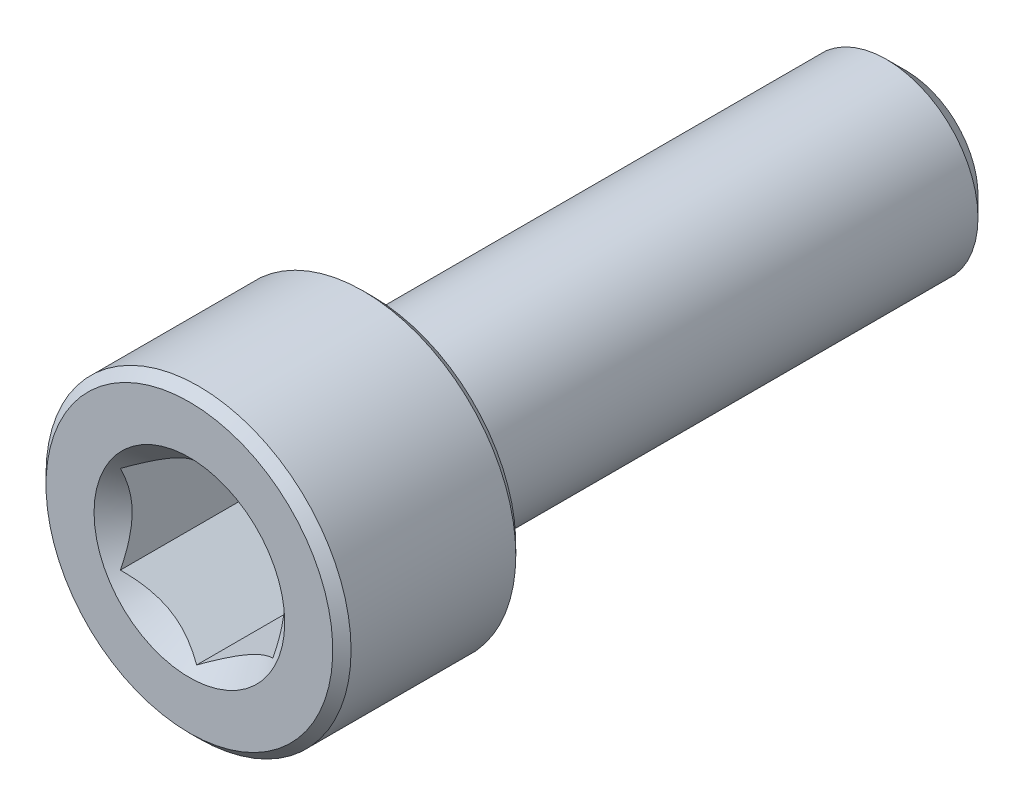
ISO-10303-21;
HEADER;
FILE_DESCRIPTION(('STEP AP214'),'2;1');
FILE_NAME('part.step','',(''),(''),'','','');
FILE_SCHEMA(('AUTOMOTIVE_DESIGN { 1 0 10303 214 1 1 1 1 }'));
ENDSEC;
DATA;
#1=APPLICATION_CONTEXT('core data for automotive mechanical design processes');
#2=APPLICATION_PROTOCOL_DEFINITION('international standard','automotive_design',2000,#1);
#3=PRODUCT_CONTEXT('',#1,'mechanical');
#4=PRODUCT('Part','Part','',(#3));
#5=PRODUCT_RELATED_PRODUCT_CATEGORY('part','',(#4));
#6=PRODUCT_DEFINITION_FORMATION('','',#4);
#7=PRODUCT_DEFINITION_CONTEXT('part definition',#1,'design');
#8=PRODUCT_DEFINITION('design','',#6,#7);
#9=PRODUCT_DEFINITION_SHAPE('','',#8);
#10=(LENGTH_UNIT() NAMED_UNIT(*) SI_UNIT(.MILLI.,.METRE.));
#11=(NAMED_UNIT(*) PLANE_ANGLE_UNIT() SI_UNIT($,.RADIAN.));
#12=(NAMED_UNIT(*) SI_UNIT($,.STERADIAN.) SOLID_ANGLE_UNIT());
#13=UNCERTAINTY_MEASURE_WITH_UNIT(LENGTH_MEASURE(1.E-05),#10,'distance_accuracy_value','');
#14=(GEOMETRIC_REPRESENTATION_CONTEXT(3) GLOBAL_UNCERTAINTY_ASSIGNED_CONTEXT((#13)) GLOBAL_UNIT_ASSIGNED_CONTEXT((#10,
#11,#12)) REPRESENTATION_CONTEXT('',''));
#15=CARTESIAN_POINT('',(0.,0.,0.));
#16=DIRECTION('',(0.,0.,1.));
#17=DIRECTION('',(1.,0.,0.));
#18=AXIS2_PLACEMENT_3D('',#15,#16,#17);
#19=CARTESIAN_POINT('',(0.,0.,-10.5));
#20=DIRECTION('',(0.,0.,-1.));
#21=DIRECTION('',(0.,1.,0.));
#22=AXIS2_PLACEMENT_3D('',#19,#20,#21);
#23=CYLINDRICAL_SURFACE('',#22,3.);
#24=CARTESIAN_POINT('',(0.,0.,4.2));
#25=DIRECTION('',(0.,0.,-1.));
#26=DIRECTION('',(0.,1.,0.));
#27=AXIS2_PLACEMENT_3D('',#24,#25,#26);
#28=CIRCLE('',#27,3.);
#29=CARTESIAN_POINT('',(0.,3.,4.2));
#30=VERTEX_POINT('',#29);
#31=EDGE_CURVE('E56',#30,#30,#28,.T.);
#32=ORIENTED_EDGE('',*,*,#31,.T.);
#33=EDGE_LOOP('',(#32));
#34=FACE_BOUND('',#33,.T.);
#35=CARTESIAN_POINT('',(0.,0.,-12.3504809471617));
#36=DIRECTION('',(0.,0.,-1.));
#37=DIRECTION('',(0.,1.,0.));
#38=AXIS2_PLACEMENT_3D('',#35,#36,#37);
#39=CIRCLE('',#38,3.);
#40=CARTESIAN_POINT('',(0.,3.,-12.3504809471617));
#41=VERTEX_POINT('',#40);
#42=EDGE_CURVE('E372',#41,#41,#39,.T.);
#43=ORIENTED_EDGE('',*,*,#42,.F.);
#44=EDGE_LOOP('',(#43));
#45=FACE_BOUND('',#44,.T.);
#46=ADVANCED_FACE('F43',(#34,#45),#23,.T.);
#47=CARTESIAN_POINT('',(0.,0.,4.2));
#48=DIRECTION('',(0.,0.,-1.));
#49=DIRECTION('',(0.,1.,0.));
#50=AXIS2_PLACEMENT_3D('',#47,#48,#49);
#51=TOROIDAL_SURFACE('',#50,3.3,0.3);
#52=CARTESIAN_POINT('',(0.,0.,4.5));
#53=DIRECTION('',(0.,0.,-1.));
#54=DIRECTION('',(0.,1.,0.));
#55=AXIS2_PLACEMENT_3D('',#52,#53,#54);
#56=CIRCLE('',#55,3.3);
#57=CARTESIAN_POINT('',(0.,3.3,4.5));
#58=VERTEX_POINT('',#57);
#59=EDGE_CURVE('E153',#58,#58,#56,.T.);
#60=ORIENTED_EDGE('',*,*,#59,.T.);
#61=EDGE_LOOP('',(#60));
#62=FACE_BOUND('',#61,.T.);
#63=ORIENTED_EDGE('',*,*,#31,.F.);
#64=EDGE_LOOP('',(#63));
#65=FACE_BOUND('',#64,.T.);
#66=ADVANCED_FACE('F160',(#62,#65),#51,.F.);
#67=CARTESIAN_POINT('',(0.,4.7,4.5));
#68=DIRECTION('',(0.,0.,-1.));
#69=DIRECTION('',(0.,1.,0.));
#70=AXIS2_PLACEMENT_3D('',#67,#68,#69);
#71=PLANE('',#70);
#72=CARTESIAN_POINT('',(0.,0.,4.5));
#73=DIRECTION('',(0.,0.,-1.));
#74=DIRECTION('',(0.,1.,0.));
#75=AXIS2_PLACEMENT_3D('',#72,#73,#74);
#76=CIRCLE('',#75,4.7);
#77=CARTESIAN_POINT('',(0.,4.7,4.5));
#78=VERTEX_POINT('',#77);
#79=EDGE_CURVE('E150',#78,#78,#76,.T.);
#80=ORIENTED_EDGE('',*,*,#79,.T.);
#81=EDGE_LOOP('',(#80));
#82=FACE_BOUND('',#81,.T.);
#83=ORIENTED_EDGE('',*,*,#59,.F.);
#84=EDGE_LOOP('',(#83));
#85=FACE_BOUND('',#84,.T.);
#86=ADVANCED_FACE('F162',(#82,#85),#71,.T.);
#87=CARTESIAN_POINT('',(0.,0.,4.5));
#88=DIRECTION('',(0.,0.,1.));
#89=DIRECTION('',(0.,-1.,0.));
#90=AXIS2_PLACEMENT_3D('',#87,#88,#89);
#91=CONICAL_SURFACE('',#90,4.7,0.785398163397451);
#92=CARTESIAN_POINT('',(0.,0.,4.8));
#93=DIRECTION('',(0.,0.,-1.));
#94=DIRECTION('',(0.,1.,0.));
#95=AXIS2_PLACEMENT_3D('',#92,#93,#94);
#96=CIRCLE('',#95,5.);
#97=CARTESIAN_POINT('',(0.,5.,4.8));
#98=VERTEX_POINT('',#97);
#99=EDGE_CURVE('E147',#98,#98,#96,.T.);
#100=ORIENTED_EDGE('',*,*,#99,.T.);
#101=EDGE_LOOP('',(#100));
#102=FACE_BOUND('',#101,.T.);
#103=ORIENTED_EDGE('',*,*,#79,.F.);
#104=EDGE_LOOP('',(#103));
#105=FACE_BOUND('',#104,.T.);
#106=ADVANCED_FACE('F168',(#102,#105),#91,.T.);
#107=CARTESIAN_POINT('',(0.,0.,-10.5));
#108=DIRECTION('',(0.,0.,-1.));
#109=DIRECTION('',(0.,1.,0.));
#110=AXIS2_PLACEMENT_3D('',#107,#108,#109);
#111=CYLINDRICAL_SURFACE('',#110,5.);
#112=CARTESIAN_POINT('',(0.,0.,10.2));
#113=DIRECTION('',(0.,0.,-1.));
#114=DIRECTION('',(0.,1.,0.));
#115=AXIS2_PLACEMENT_3D('',#112,#113,#114);
#116=CIRCLE('',#115,5.);
#117=CARTESIAN_POINT('',(0.,5.,10.2));
#118=VERTEX_POINT('',#117);
#119=EDGE_CURVE('E144',#118,#118,#116,.T.);
#120=ORIENTED_EDGE('',*,*,#119,.T.);
#121=EDGE_LOOP('',(#120));
#122=FACE_BOUND('',#121,.T.);
#123=ORIENTED_EDGE('',*,*,#99,.F.);
#124=EDGE_LOOP('',(#123));
#125=FACE_BOUND('',#124,.T.);
#126=ADVANCED_FACE('F275',(#122,#125),#111,.T.);
#127=CARTESIAN_POINT('',(0.,0.,10.2));
#128=DIRECTION('',(0.,0.,-1.));
#129=DIRECTION('',(0.,1.,0.));
#130=AXIS2_PLACEMENT_3D('',#127,#128,#129);
#131=CONICAL_SURFACE('',#130,5.,0.785398163397445);
#132=CARTESIAN_POINT('',(0.,0.,10.5));
#133=DIRECTION('',(0.,0.,-1.));
#134=DIRECTION('',(0.,1.,0.));
#135=AXIS2_PLACEMENT_3D('',#132,#133,#134);
#136=CIRCLE('',#135,4.7);
#137=CARTESIAN_POINT('',(0.,4.7,10.5));
#138=VERTEX_POINT('',#137);
#139=EDGE_CURVE('E141',#138,#138,#136,.T.);
#140=ORIENTED_EDGE('',*,*,#139,.T.);
#141=EDGE_LOOP('',(#140));
#142=FACE_BOUND('',#141,.T.);
#143=ORIENTED_EDGE('',*,*,#119,.F.);
#144=EDGE_LOOP('',(#143));
#145=FACE_BOUND('',#144,.T.);
#146=ADVANCED_FACE('F267',(#142,#145),#131,.T.);
#147=CARTESIAN_POINT('',(0.,0.,10.5));
#148=DIRECTION('',(0.,0.,1.));
#149=DIRECTION('',(0.,-1.,0.));
#150=AXIS2_PLACEMENT_3D('',#147,#148,#149);
#151=PLANE('',#150);
#152=CARTESIAN_POINT('',(0.,0.,10.5));
#153=DIRECTION('',(0.,0.,1.));
#154=DIRECTION('',(1.,0.,0.));
#155=AXIS2_PLACEMENT_3D('',#152,#153,#154);
#156=CIRCLE('',#155,3.125);
#157=CARTESIAN_POINT('',(3.125,0.,10.5));
#158=VERTEX_POINT('',#157);
#159=EDGE_CURVE('E115',#158,#158,#156,.T.);
#160=ORIENTED_EDGE('',*,*,#159,.F.);
#161=EDGE_LOOP('',(#160));
#162=FACE_BOUND('',#161,.T.);
#163=ORIENTED_EDGE('',*,*,#139,.F.);
#164=EDGE_LOOP('',(#163));
#165=FACE_BOUND('',#164,.T.);
#166=ADVANCED_FACE('F210',(#162,#165),#151,.T.);
#167=CARTESIAN_POINT('',(0.,0.,10.5));
#168=DIRECTION('',(0.,0.,1.));
#169=DIRECTION('',(1.,0.,0.));
#170=AXIS2_PLACEMENT_3D('',#167,#168,#169);
#171=CONICAL_SURFACE('',#170,3.125,0.78539816339745);
#172=ORIENTED_EDGE('',*,*,#159,.T.);
#173=EDGE_LOOP('',(#172));
#174=FACE_BOUND('',#173,.T.);
#175=CARTESIAN_POINT('',(-0.000200000000000056,-2.88686681600197,10.2618668229299));
#176=CARTESIAN_POINT('',(0.0857382777877649,-2.83725032818751,10.2122920513029));
#177=CARTESIAN_POINT('',(0.173113567275753,-2.7868041812811,10.1656288273106));
#178=CARTESIAN_POINT('',(0.351281456165589,-2.6839389026696,10.0801894859864));
#179=CARTESIAN_POINT('',(0.442091000681075,-2.6315099876986,10.0414609083541));
#180=CARTESIAN_POINT('',(0.625204123126921,-2.52578957716234,9.97511804984587));
#181=CARTESIAN_POINT('',(0.71746106452934,-2.47252500720904,9.94733701447898));
#182=CARTESIAN_POINT('',(0.904006008776285,-2.3648232334321,9.9045345218588));
#183=CARTESIAN_POINT('',(0.998288312566282,-2.31038931995913,9.88948111261947));
#184=CARTESIAN_POINT('',(1.16077825829184,-2.21657570605387,9.87589906815761));
#185=CARTESIAN_POINT('',(1.22877596788015,-2.17731721011878,9.87388844518893));
#186=CARTESIAN_POINT('',(1.36466024116922,-2.0988643883567,9.87727546313562));
#187=CARTESIAN_POINT('',(1.43254675755224,-2.05967008984862,9.88267570124795));
#188=CARTESIAN_POINT('',(1.56767878823611,-1.98165157555715,9.9005771343506));
#189=CARTESIAN_POINT('',(1.63492349975356,-1.94282782326097,9.91308627299461));
#190=CARTESIAN_POINT('',(1.7682501008182,-1.86585167424616,9.94451884790384));
#191=CARTESIAN_POINT('',(1.83433207909966,-1.82769922629678,9.96344179244495));
#192=CARTESIAN_POINT('',(2.00359634669126,-1.72997445583858,10.0196187073564));
#193=CARTESIAN_POINT('',(2.10572912222289,-1.67100807039231,10.0611071775443));
#194=CARTESIAN_POINT('',(2.25590641494051,-1.58430317001562,10.1311453926712));
#195=CARTESIAN_POINT('',(2.30539653988261,-1.55573003305807,10.1557535980642));
#196=CARTESIAN_POINT('',(2.40346006383885,-1.49911303110426,10.2072132326634));
#197=CARTESIAN_POINT('',(2.45203400349693,-1.47106885396706,10.2340632847275));
#198=CARTESIAN_POINT('',(2.5002,-1.44326020292023,10.2618668229299));
#199=B_SPLINE_CURVE_WITH_KNOTS('',3,(#175,#176,#177,#178,#179,#180,#181,#182,#183,#184,#185,
#186,#187,#188,#189,#190,#191,#192,#193,#194,#195,#196,#197,#198),.UNSPECIFIED.,.F.,.F.,(4,2,2,
2,2,2,2,2,2,2,2,4),(0.,0.333012085133924,0.667964518301398,0.997597032043298,1.32639954393844,
1.56169424147169,1.79707142102083,2.03271213522171,2.26833478775651,2.64260240809533,
2.82922877818864,3.01574133749025),.UNSPECIFIED.);
#200=CARTESIAN_POINT('',(0.,-2.88675134594813,10.2617513459481));
#201=VERTEX_POINT('',#200);
#202=CARTESIAN_POINT('',(2.5,-1.44337567297406,10.2617513459481));
#203=VERTEX_POINT('',#202);
#204=EDGE_CURVE('E12',#201,#203,#199,.T.);
#205=ORIENTED_EDGE('',*,*,#204,.F.);
#206=CARTESIAN_POINT('',(-2.5002,-1.44326020292023,10.2618668229299));
#207=CARTESIAN_POINT('',(-2.41426172221224,-1.49287669073469,10.2122920513029));
#208=CARTESIAN_POINT('',(-2.32688643272425,-1.5433228376411,10.1656288273106));
#209=CARTESIAN_POINT('',(-2.14871854383441,-1.64618811625259,10.0801894859864));
#210=CARTESIAN_POINT('',(-2.05790899931892,-1.69861703122359,10.0414609083541));
#211=CARTESIAN_POINT('',(-1.87479587687308,-1.80433744175986,9.97511804984587));
#212=CARTESIAN_POINT('',(-1.78253893547066,-1.85760201171315,9.94733701447898));
#213=CARTESIAN_POINT('',(-1.59599399122371,-1.96530378549009,9.9045345218588));
#214=CARTESIAN_POINT('',(-1.50171168743372,-2.01973769896307,9.88948111261947));
#215=CARTESIAN_POINT('',(-1.33922174170816,-2.11355131286833,9.87589906815761));
#216=CARTESIAN_POINT('',(-1.27122403211985,-2.15280980880341,9.87388844518893));
#217=CARTESIAN_POINT('',(-1.13533975883078,-2.23126263056549,9.87727546313562));
#218=CARTESIAN_POINT('',(-1.06745324244776,-2.27045692907357,9.88267570124795));
#219=CARTESIAN_POINT('',(-0.932321211763895,-2.34847544336505,9.9005771343506));
#220=CARTESIAN_POINT('',(-0.865076500246441,-2.38729919566123,9.91308627299461));
#221=CARTESIAN_POINT('',(-0.731749899181802,-2.46427534467603,9.94451884790384));
#222=CARTESIAN_POINT('',(-0.665667920900344,-2.50242779262542,9.96344179244495));
#223=CARTESIAN_POINT('',(-0.496403653308736,-2.60015256308362,10.0196187073564));
#224=CARTESIAN_POINT('',(-0.394270877777108,-2.65911894852989,10.0611071775443));
#225=CARTESIAN_POINT('',(-0.244093585059491,-2.74582384890657,10.1311453926712));
#226=CARTESIAN_POINT('',(-0.19460346011739,-2.77439698586412,10.1557535980642));
#227=CARTESIAN_POINT('',(-0.0965399361611525,-2.83101398781794,10.2072132326634));
#228=CARTESIAN_POINT('',(-0.0479659965030715,-2.85905816495513,10.2340632847275));
#229=CARTESIAN_POINT('',(0.000200000000000305,-2.88686681600197,10.2618668229299));
#230=B_SPLINE_CURVE_WITH_KNOTS('',3,(#206,#207,#208,#209,#210,#211,#212,#213,#214,#215,#216,
#217,#218,#219,#220,#221,#222,#223,#224,#225,#226,#227,#228,#229),.UNSPECIFIED.,.F.,.F.,(4,2,2,
2,2,2,2,2,2,2,2,4),(0.,0.333012085133924,0.667964518301397,0.997597032043299,1.32639954393844,
1.56169424147168,1.79707142102083,2.03271213522171,2.2683347877565,2.64260240809533,
2.82922877818864,3.01574133749025),.UNSPECIFIED.);
#231=CARTESIAN_POINT('',(-2.5,-1.44337567297406,10.2617513459481));
#232=VERTEX_POINT('',#231);
#233=EDGE_CURVE('E101',#232,#201,#230,.T.);
#234=ORIENTED_EDGE('',*,*,#233,.F.);
#235=CARTESIAN_POINT('',(-2.5,-3.05811902614614,11.3249483513176));
#236=CARTESIAN_POINT('',(-2.5,-2.98440983945656,11.2678941624606));
#237=CARTESIAN_POINT('',(-2.5,-2.91030875691711,11.211338408655));
#238=CARTESIAN_POINT('',(-2.5,-2.76116077091499,11.0994529908989));
#239=CARTESIAN_POINT('',(-2.5,-2.68611365209695,11.0441236143263));
#240=CARTESIAN_POINT('',(-2.5,-2.53436379087041,10.9345266506783));
#241=CARTESIAN_POINT('',(-2.5,-2.45765275083383,10.8802705155369));
#242=CARTESIAN_POINT('',(-2.5,-2.30296317551963,10.7736026001631));
#243=CARTESIAN_POINT('',(-2.5,-2.22498472739569,10.7211906938896));
#244=CARTESIAN_POINT('',(-2.5,-2.06236769759978,10.615263211588));
#245=CARTESIAN_POINT('',(-2.5,-1.97762830350827,10.5619016261172));
#246=CARTESIAN_POINT('',(-2.5,-1.80618229870077,10.4584430751365));
#247=CARTESIAN_POINT('',(-2.5,-1.71947594494662,10.4083456864684));
#248=CARTESIAN_POINT('',(-2.5,-1.54402392194024,10.3124525300635));
#249=CARTESIAN_POINT('',(-2.5,-1.45528486870173,10.2666447518847));
#250=CARTESIAN_POINT('',(-2.5,-1.27526975606122,10.1803657409276));
#251=CARTESIAN_POINT('',(-2.5,-1.18399493457035,10.1398919577617));
#252=CARTESIAN_POINT('',(-2.5,-1.00836471270812,10.0696282555703));
#253=CARTESIAN_POINT('',(-2.5,-0.924281821785679,10.0391640684491));
#254=CARTESIAN_POINT('',(-2.5,-0.753934603970131,9.98496243419846));
#255=CARTESIAN_POINT('',(-2.5,-0.667670141814685,9.96122540528727));
#256=CARTESIAN_POINT('',(-2.5,-0.495001348242842,9.92217521126134));
#257=CARTESIAN_POINT('',(-2.5,-0.408632911050734,9.90670602865601));
#258=CARTESIAN_POINT('',(-2.5,-0.234772754668958,9.88452108838909));
#259=CARTESIAN_POINT('',(-2.5,-0.147281287804294,9.87780339802018));
#260=CARTESIAN_POINT('',(-2.5,0.0238518936773456,9.8737182218653));
#261=CARTESIAN_POINT('',(-2.5,0.107483635135722,9.87593086761492));
#262=CARTESIAN_POINT('',(-2.5,0.274114195685814,9.88860968001105));
#263=CARTESIAN_POINT('',(-2.5,0.35711295814558,9.89907657660914));
#264=CARTESIAN_POINT('',(-2.5,0.523288144897416,9.92784213274085));
#265=CARTESIAN_POINT('',(-2.5,0.606439950061686,9.94628080314541));
#266=CARTESIAN_POINT('',(-2.5,0.770896010035104,9.989956208676));
#267=CARTESIAN_POINT('',(-2.5,0.852200351882828,10.0151926228204));
#268=CARTESIAN_POINT('',(-2.5,1.10064624940811,10.1020006776711));
#269=CARTESIAN_POINT('',(-2.5,1.26445670942465,10.1731337561378));
#270=CARTESIAN_POINT('',(-2.5,1.50421272270141,10.2918201200772));
#271=CARTESIAN_POINT('',(-2.5,1.58328419057904,10.333471615305));
#272=CARTESIAN_POINT('',(-2.5,1.73963927584191,10.4200124035774));
#273=CARTESIAN_POINT('',(-2.5,1.81692320237102,10.4649011311494));
#274=CARTESIAN_POINT('',(-2.5,1.96613896389381,10.5549912173065));
#275=CARTESIAN_POINT('',(-2.5,2.03814682362153,10.6000680708391));
#276=CARTESIAN_POINT('',(-2.5,2.18092679643222,10.6921473192976));
#277=CARTESIAN_POINT('',(-2.5,2.25169881661102,10.7391498581055));
#278=CARTESIAN_POINT('',(-2.5,2.39159945333184,10.8343550134732));
#279=CARTESIAN_POINT('',(-2.5,2.46073668867174,10.8825450175112));
#280=CARTESIAN_POINT('',(-2.5,2.59806183277128,10.9802211436377));
#281=CARTESIAN_POINT('',(-2.5,2.66624999804919,11.0297069046595));
#282=CARTESIAN_POINT('',(-2.5,2.73404006469875,11.0797233466722));
#283=B_SPLINE_CURVE_WITH_KNOTS('',3,(#235,#236,#237,#238,#239,#240,#241,#242,#243,#244,#245,
#246,#247,#248,#249,#250,#251,#252,#253,#254,#255,#256,#257,#258,#259,#260,#261,#262,#263,#264,
#265,#266,#267,#268,#269,#270,#271,#272,#273,#274,#275,#276,#277,#278,#279,#280,#281,#282),
.UNSPECIFIED.,.F.,.F.,(4,2,2,2,2,2,2,2,2,2,2,2,2,2,2,2,2,2,2,2,2,2,2,4),(0.,0.279636937737095,
0.55933872465569,0.841193583356593,1.1230291415439,1.42339426279004,1.72372036804098,
2.02317874224782,2.32249341038692,2.59055815083282,2.85863955284488,3.12146553699264,
3.38423346797086,3.6347944563997,3.88537760527732,4.14055298164195,4.39571631103123,
4.92983151325628,5.19792074748275,5.46596326536873,5.72079181091925,5.9756394314289,
6.22844778309936,6.48118642327295),.UNSPECIFIED.);
#284=CARTESIAN_POINT('',(-2.5,1.44337567297406,10.2617513459481));
#285=VERTEX_POINT('',#284);
#286=EDGE_CURVE('E114',#285,#232,#283,.F.);
#287=ORIENTED_EDGE('',*,*,#286,.F.);
#288=CARTESIAN_POINT('',(0.000199999999999188,2.88686681600197,10.2618668229299));
#289=CARTESIAN_POINT('',(-0.0857382777877659,2.83725032818751,10.2122920513029));
#290=CARTESIAN_POINT('',(-0.173113567275754,2.7868041812811,10.1656288273106));
#291=CARTESIAN_POINT('',(-0.351281456165589,2.6839389026696,10.0801894859864));
#292=CARTESIAN_POINT('',(-0.442091000681075,2.6315099876986,10.0414609083541));
#293=CARTESIAN_POINT('',(-0.625204123126921,2.52578957716234,9.97511804984587));
#294=CARTESIAN_POINT('',(-0.71746106452934,2.47252500720904,9.94733701447898));
#295=CARTESIAN_POINT('',(-0.904006008776285,2.3648232334321,9.9045345218588));
#296=CARTESIAN_POINT('',(-0.998288312566282,2.31038931995913,9.88948111261947));
#297=CARTESIAN_POINT('',(-1.16077825829184,2.21657570605387,9.87589906815761));
#298=CARTESIAN_POINT('',(-1.22877596788015,2.17731721011878,9.87388844518893));
#299=CARTESIAN_POINT('',(-1.36466024116922,2.0988643883567,9.87727546313562));
#300=CARTESIAN_POINT('',(-1.43254675755224,2.05967008984862,9.88267570124795));
#301=CARTESIAN_POINT('',(-1.5676787882361,1.98165157555715,9.9005771343506));
#302=CARTESIAN_POINT('',(-1.63492349975356,1.94282782326097,9.91308627299461));
#303=CARTESIAN_POINT('',(-1.7682501008182,1.86585167424616,9.94451884790384));
#304=CARTESIAN_POINT('',(-1.83433207909966,1.82769922629678,9.96344179244495));
#305=CARTESIAN_POINT('',(-2.00359634669126,1.72997445583858,10.0196187073564));
#306=CARTESIAN_POINT('',(-2.10572912222289,1.67100807039231,10.0611071775443));
#307=CARTESIAN_POINT('',(-2.25590641494051,1.58430317001562,10.1311453926712));
#308=CARTESIAN_POINT('',(-2.30539653988261,1.55573003305807,10.1557535980642));
#309=CARTESIAN_POINT('',(-2.40346006383885,1.49911303110426,10.2072132326634));
#310=CARTESIAN_POINT('',(-2.45203400349693,1.47106885396706,10.2340632847275));
#311=CARTESIAN_POINT('',(-2.5002,1.44326020292023,10.2618668229299));
#312=B_SPLINE_CURVE_WITH_KNOTS('',3,(#288,#289,#290,#291,#292,#293,#294,#295,#296,#297,#298,
#299,#300,#301,#302,#303,#304,#305,#306,#307,#308,#309,#310,#311),.UNSPECIFIED.,.F.,.F.,(4,2,2,
2,2,2,2,2,2,2,2,4),(0.,0.333012085133923,0.667964518301396,0.997597032043297,1.32639954393844,
1.56169424147168,1.79707142102082,2.0327121352217,2.2683347877565,2.64260240809533,
2.82922877818863,3.01574133749025),.UNSPECIFIED.);
#313=CARTESIAN_POINT('',(0.,2.88675134594813,10.2617513459481));
#314=VERTEX_POINT('',#313);
#315=EDGE_CURVE('E230',#314,#285,#312,.T.);
#316=ORIENTED_EDGE('',*,*,#315,.F.);
#317=CARTESIAN_POINT('',(2.5002,1.44326020292023,10.2618668229299));
#318=CARTESIAN_POINT('',(2.41426172221224,1.49287669073468,10.2122920513029));
#319=CARTESIAN_POINT('',(2.32688643272425,1.5433228376411,10.1656288273106));
#320=CARTESIAN_POINT('',(2.14871854383441,1.64618811625259,10.0801894859864));
#321=CARTESIAN_POINT('',(2.05790899931892,1.69861703122359,10.0414609083541));
#322=CARTESIAN_POINT('',(1.87479587687308,1.80433744175986,9.97511804984587));
#323=CARTESIAN_POINT('',(1.78253893547066,1.85760201171315,9.94733701447898));
#324=CARTESIAN_POINT('',(1.59599399122371,1.96530378549009,9.90453452185879));
#325=CARTESIAN_POINT('',(1.50171168743372,2.01973769896307,9.88948111261947));
#326=CARTESIAN_POINT('',(1.33922174170815,2.11355131286833,9.87589906815761));
#327=CARTESIAN_POINT('',(1.27122403211985,2.15280980880341,9.87388844518893));
#328=CARTESIAN_POINT('',(1.13533975883078,2.23126263056549,9.87727546313562));
#329=CARTESIAN_POINT('',(1.06745324244776,2.27045692907357,9.88267570124795));
#330=CARTESIAN_POINT('',(0.932321211763893,2.34847544336505,9.9005771343506));
#331=CARTESIAN_POINT('',(0.865076500246439,2.38729919566123,9.91308627299461));
#332=CARTESIAN_POINT('',(0.7317498991818,2.46427534467603,9.94451884790384));
#333=CARTESIAN_POINT('',(0.665667920900342,2.50242779262542,9.96344179244495));
#334=CARTESIAN_POINT('',(0.496403653308734,2.60015256308362,10.0196187073564));
#335=CARTESIAN_POINT('',(0.394270877777106,2.65911894852989,10.0611071775443));
#336=CARTESIAN_POINT('',(0.244093585059491,2.74582384890657,10.1311453926712));
#337=CARTESIAN_POINT('',(0.19460346011739,2.77439698586412,10.1557535980642));
#338=CARTESIAN_POINT('',(0.0965399361611525,2.83101398781794,10.2072132326634));
#339=CARTESIAN_POINT('',(0.0479659965030713,2.85905816495513,10.2340632847275));
#340=CARTESIAN_POINT('',(-0.000200000000000713,2.88686681600197,10.2618668229299));
#341=B_SPLINE_CURVE_WITH_KNOTS('',3,(#317,#318,#319,#320,#321,#322,#323,#324,#325,#326,#327,
#328,#329,#330,#331,#332,#333,#334,#335,#336,#337,#338,#339,#340),.UNSPECIFIED.,.F.,.F.,(4,2,2,
2,2,2,2,2,2,2,2,4),(0.,0.333012085133925,0.667964518301398,0.997597032043301,1.32639954393844,
1.56169424147169,1.79707142102083,2.03271213522171,2.26833478775651,2.64260240809533,
2.82922877818864,3.01574133749025),.UNSPECIFIED.);
#342=CARTESIAN_POINT('',(2.5,1.44337567297406,10.2617513459481));
#343=VERTEX_POINT('',#342);
#344=EDGE_CURVE('E202',#343,#314,#341,.T.);
#345=ORIENTED_EDGE('',*,*,#344,.F.);
#346=CARTESIAN_POINT('',(2.5,-3.05811902614614,11.3249483513176));
#347=CARTESIAN_POINT('',(2.5,-2.98440983945656,11.2678941624606));
#348=CARTESIAN_POINT('',(2.5,-2.91030875691711,11.211338408655));
#349=CARTESIAN_POINT('',(2.5,-2.76116077091499,11.0994529908989));
#350=CARTESIAN_POINT('',(2.5,-2.68611365209695,11.0441236143263));
#351=CARTESIAN_POINT('',(2.5,-2.53436379087041,10.9345266506783));
#352=CARTESIAN_POINT('',(2.5,-2.45765275083384,10.8802705155369));
#353=CARTESIAN_POINT('',(2.5,-2.30296317551963,10.7736026001631));
#354=CARTESIAN_POINT('',(2.5,-2.2249847273957,10.7211906938896));
#355=CARTESIAN_POINT('',(2.5,-2.06236769759978,10.615263211588));
#356=CARTESIAN_POINT('',(2.5,-1.97762830350827,10.5619016261172));
#357=CARTESIAN_POINT('',(2.5,-1.80618229870077,10.4584430751365));
#358=CARTESIAN_POINT('',(2.5,-1.71947594494662,10.4083456864684));
#359=CARTESIAN_POINT('',(2.5,-1.54402392194024,10.3124525300635));
#360=CARTESIAN_POINT('',(2.5,-1.45528486870173,10.2666447518847));
#361=CARTESIAN_POINT('',(2.5,-1.27526975606122,10.1803657409276));
#362=CARTESIAN_POINT('',(2.5,-1.18399493457035,10.1398919577617));
#363=CARTESIAN_POINT('',(2.5,-1.00836471270812,10.0696282555703));
#364=CARTESIAN_POINT('',(2.5,-0.924281821785679,10.0391640684491));
#365=CARTESIAN_POINT('',(2.5,-0.753934603970131,9.98496243419846));
#366=CARTESIAN_POINT('',(2.5,-0.667670141814685,9.96122540528727));
#367=CARTESIAN_POINT('',(2.5,-0.495001348242842,9.92217521126134));
#368=CARTESIAN_POINT('',(2.5,-0.408632911050733,9.90670602865601));
#369=CARTESIAN_POINT('',(2.5,-0.234772754668958,9.88452108838909));
#370=CARTESIAN_POINT('',(2.5,-0.147281287804293,9.87780339802018));
#371=CARTESIAN_POINT('',(2.5,0.0238518936773465,9.8737182218653));
#372=CARTESIAN_POINT('',(2.5,0.107483635135723,9.87593086761492));
#373=CARTESIAN_POINT('',(2.5,0.274114195685815,9.88860968001105));
#374=CARTESIAN_POINT('',(2.5,0.357112958145581,9.89907657660914));
#375=CARTESIAN_POINT('',(2.5,0.523288144897418,9.92784213274086));
#376=CARTESIAN_POINT('',(2.5,0.606439950061688,9.94628080314541));
#377=CARTESIAN_POINT('',(2.5,0.770896010035105,9.989956208676));
#378=CARTESIAN_POINT('',(2.5,0.85220035188283,10.0151926228204));
#379=CARTESIAN_POINT('',(2.5,1.10064624940811,10.1020006776711));
#380=CARTESIAN_POINT('',(2.5,1.26445670942465,10.1731337561378));
#381=CARTESIAN_POINT('',(2.5,1.50421272270141,10.2918201200772));
#382=CARTESIAN_POINT('',(2.5,1.58328419057904,10.333471615305));
#383=CARTESIAN_POINT('',(2.5,1.73963927584192,10.4200124035774));
#384=CARTESIAN_POINT('',(2.5,1.81692320237102,10.4649011311494));
#385=CARTESIAN_POINT('',(2.5,1.96613896389381,10.5549912173065));
#386=CARTESIAN_POINT('',(2.5,2.03814682362154,10.6000680708391));
#387=CARTESIAN_POINT('',(2.5,2.18092679643222,10.6921473192976));
#388=CARTESIAN_POINT('',(2.5,2.25169881661102,10.7391498581055));
#389=CARTESIAN_POINT('',(2.5,2.39159945333184,10.8343550134732));
#390=CARTESIAN_POINT('',(2.5,2.46073668867174,10.8825450175112));
#391=CARTESIAN_POINT('',(2.5,2.59806183277128,10.9802211436377));
#392=CARTESIAN_POINT('',(2.5,2.6662499980492,11.0297069046595));
#393=CARTESIAN_POINT('',(2.5,2.73404006469875,11.0797233466722));
#394=B_SPLINE_CURVE_WITH_KNOTS('',3,(#346,#347,#348,#349,#350,#351,#352,#353,#354,#355,#356,
#357,#358,#359,#360,#361,#362,#363,#364,#365,#366,#367,#368,#369,#370,#371,#372,#373,#374,#375,
#376,#377,#378,#379,#380,#381,#382,#383,#384,#385,#386,#387,#388,#389,#390,#391,#392,#393),
.UNSPECIFIED.,.F.,.F.,(4,2,2,2,2,2,2,2,2,2,2,2,2,2,2,2,2,2,2,2,2,2,2,4),(0.,0.279636937737094,
0.559338724655691,0.841193583356593,1.1230291415439,1.42339426279004,1.72372036804098,
2.02317874224782,2.32249341038693,2.59055815083283,2.85863955284489,3.12146553699265,
3.38423346797087,3.6347944563997,3.88537760527732,4.14055298164195,4.39571631103123,
4.92983151325628,5.19792074748275,5.46596326536874,5.72079181091925,5.97563943142891,
6.22844778309936,6.48118642327296),.UNSPECIFIED.);
#395=EDGE_CURVE('E63',#203,#343,#394,.T.);
#396=ORIENTED_EDGE('',*,*,#395,.F.);
#397=EDGE_LOOP('',(#205,#234,#287,#316,#345,#396));
#398=FACE_BOUND('',#397,.T.);
#399=ADVANCED_FACE('F100',(#174,#398),#171,.F.);
#400=CARTESIAN_POINT('',(0.,4.7,5.5));
#401=DIRECTION('',(0.,0.,-1.));
#402=DIRECTION('',(0.,1.,0.));
#403=AXIS2_PLACEMENT_3D('',#400,#401,#402);
#404=PLANE('',#403);
#405=DIRECTION('',(0.866025403784439,0.5,0.));
#406=VECTOR('',#405,1.);
#407=CARTESIAN_POINT('',(0.,-2.88675134594813,5.5));
#408=LINE('',#407,#406);
#409=CARTESIAN_POINT('',(0.,-2.88675134594813,5.5));
#410=VERTEX_POINT('',#409);
#411=CARTESIAN_POINT('',(2.5,-1.44337567297406,5.5));
#412=VERTEX_POINT('',#411);
#413=EDGE_CURVE('E118',#410,#412,#408,.T.);
#414=ORIENTED_EDGE('',*,*,#413,.T.);
#415=DIRECTION('',(0.,1.,0.));
#416=VECTOR('',#415,1.);
#417=CARTESIAN_POINT('',(2.5,-1.44337567297406,5.5));
#418=LINE('',#417,#416);
#419=CARTESIAN_POINT('',(2.5,1.44337567297406,5.5));
#420=VERTEX_POINT('',#419);
#421=EDGE_CURVE('E70',#412,#420,#418,.T.);
#422=ORIENTED_EDGE('',*,*,#421,.T.);
#423=DIRECTION('',(-0.866025403784439,0.5,0.));
#424=VECTOR('',#423,1.);
#425=CARTESIAN_POINT('',(2.5,1.44337567297406,5.5));
#426=LINE('',#425,#424);
#427=CARTESIAN_POINT('',(0.,2.88675134594813,5.5));
#428=VERTEX_POINT('',#427);
#429=EDGE_CURVE('E126',#420,#428,#426,.T.);
#430=ORIENTED_EDGE('',*,*,#429,.T.);
#431=DIRECTION('',(-0.866025403784439,-0.5,0.));
#432=VECTOR('',#431,1.);
#433=CARTESIAN_POINT('',(0.,2.88675134594813,5.5));
#434=LINE('',#433,#432);
#435=CARTESIAN_POINT('',(-2.5,1.44337567297406,5.5));
#436=VERTEX_POINT('',#435);
#437=EDGE_CURVE('E133',#428,#436,#434,.T.);
#438=ORIENTED_EDGE('',*,*,#437,.T.);
#439=DIRECTION('',(0.,-1.,0.));
#440=VECTOR('',#439,1.);
#441=CARTESIAN_POINT('',(-2.5,1.44337567297406,5.5));
#442=LINE('',#441,#440);
#443=CARTESIAN_POINT('',(-2.5,-1.44337567297406,5.5));
#444=VERTEX_POINT('',#443);
#445=EDGE_CURVE('E129',#436,#444,#442,.T.);
#446=ORIENTED_EDGE('',*,*,#445,.T.);
#447=DIRECTION('',(0.866025403784439,-0.5,0.));
#448=VECTOR('',#447,1.);
#449=CARTESIAN_POINT('',(-2.5,-1.44337567297406,5.5));
#450=LINE('',#449,#448);
#451=EDGE_CURVE('E119',#444,#410,#450,.T.);
#452=ORIENTED_EDGE('',*,*,#451,.T.);
#453=EDGE_LOOP('',(#414,#422,#430,#438,#446,#452));
#454=FACE_BOUND('',#453,.T.);
#455=ADVANCED_FACE('F193',(#454),#404,.F.);
#456=CARTESIAN_POINT('',(0.,-2.88675134594813,-3.13762615825973));
#457=DIRECTION('',(0.5,-0.866025403784439,0.));
#458=DIRECTION('',(0.866025403784439,0.5,0.));
#459=AXIS2_PLACEMENT_3D('',#456,#457,#458);
#460=PLANE('',#459);
#461=DIRECTION('',(0.,0.,1.));
#462=VECTOR('',#461,1.);
#463=CARTESIAN_POINT('',(0.,-2.88675134594813,-3.13762615825973));
#464=LINE('',#463,#462);
#465=EDGE_CURVE('E110',#410,#201,#464,.T.);
#466=ORIENTED_EDGE('',*,*,#465,.T.);
#467=ORIENTED_EDGE('',*,*,#204,.T.);
#468=DIRECTION('',(0.,0.,1.));
#469=VECTOR('',#468,1.);
#470=CARTESIAN_POINT('',(2.5,-1.44337567297406,-3.13762615825973));
#471=LINE('',#470,#469);
#472=EDGE_CURVE('E121',#412,#203,#471,.T.);
#473=ORIENTED_EDGE('',*,*,#472,.F.);
#474=ORIENTED_EDGE('',*,*,#413,.F.);
#475=EDGE_LOOP('',(#466,#467,#473,#474));
#476=FACE_BOUND('',#475,.T.);
#477=ADVANCED_FACE('F117',(#476),#460,.F.);
#478=CARTESIAN_POINT('',(-2.5,-1.44337567297406,-3.13762615825973));
#479=DIRECTION('',(-0.5,-0.866025403784439,0.));
#480=DIRECTION('',(0.866025403784439,-0.5,0.));
#481=AXIS2_PLACEMENT_3D('',#478,#479,#480);
#482=PLANE('',#481);
#483=DIRECTION('',(0.,0.,1.));
#484=VECTOR('',#483,1.);
#485=CARTESIAN_POINT('',(-2.5,-1.44337567297406,-3.13762615825973));
#486=LINE('',#485,#484);
#487=EDGE_CURVE('E113',#444,#232,#486,.T.);
#488=ORIENTED_EDGE('',*,*,#487,.T.);
#489=ORIENTED_EDGE('',*,*,#233,.T.);
#490=ORIENTED_EDGE('',*,*,#465,.F.);
#491=ORIENTED_EDGE('',*,*,#451,.F.);
#492=EDGE_LOOP('',(#488,#489,#490,#491));
#493=FACE_BOUND('',#492,.T.);
#494=ADVANCED_FACE('F109',(#493),#482,.F.);
#495=CARTESIAN_POINT('',(-2.5,1.44337567297406,-3.13762615825973));
#496=DIRECTION('',(-1.,0.,0.));
#497=DIRECTION('',(0.,0.,1.));
#498=AXIS2_PLACEMENT_3D('',#495,#496,#497);
#499=PLANE('',#498);
#500=DIRECTION('',(0.,0.,1.));
#501=VECTOR('',#500,1.);
#502=CARTESIAN_POINT('',(-2.5,1.44337567297406,-3.13762615825973));
#503=LINE('',#502,#501);
#504=EDGE_CURVE('E130',#436,#285,#503,.T.);
#505=ORIENTED_EDGE('',*,*,#504,.T.);
#506=ORIENTED_EDGE('',*,*,#286,.T.);
#507=ORIENTED_EDGE('',*,*,#487,.F.);
#508=ORIENTED_EDGE('',*,*,#445,.F.);
#509=EDGE_LOOP('',(#505,#506,#507,#508));
#510=FACE_BOUND('',#509,.T.);
#511=ADVANCED_FACE('F238',(#510),#499,.F.);
#512=CARTESIAN_POINT('',(0.,2.88675134594813,-3.13762615825973));
#513=DIRECTION('',(-0.5,0.866025403784439,0.));
#514=DIRECTION('',(-0.866025403784439,-0.5,0.));
#515=AXIS2_PLACEMENT_3D('',#512,#513,#514);
#516=PLANE('',#515);
#517=DIRECTION('',(0.,0.,1.));
#518=VECTOR('',#517,1.);
#519=CARTESIAN_POINT('',(0.,2.88675134594813,-3.13762615825973));
#520=LINE('',#519,#518);
#521=EDGE_CURVE('E134',#428,#314,#520,.T.);
#522=ORIENTED_EDGE('',*,*,#521,.T.);
#523=ORIENTED_EDGE('',*,*,#315,.T.);
#524=ORIENTED_EDGE('',*,*,#504,.F.);
#525=ORIENTED_EDGE('',*,*,#437,.F.);
#526=EDGE_LOOP('',(#522,#523,#524,#525));
#527=FACE_BOUND('',#526,.T.);
#528=ADVANCED_FACE('F186',(#527),#516,.F.);
#529=CARTESIAN_POINT('',(2.5,1.44337567297406,-3.13762615825973));
#530=DIRECTION('',(0.5,0.866025403784439,0.));
#531=DIRECTION('',(-0.866025403784439,0.5,0.));
#532=AXIS2_PLACEMENT_3D('',#529,#530,#531);
#533=PLANE('',#532);
#534=DIRECTION('',(0.,0.,1.));
#535=VECTOR('',#534,1.);
#536=CARTESIAN_POINT('',(2.5,1.44337567297406,-3.13762615825973));
#537=LINE('',#536,#535);
#538=EDGE_CURVE('E137',#420,#343,#537,.T.);
#539=ORIENTED_EDGE('',*,*,#538,.T.);
#540=ORIENTED_EDGE('',*,*,#344,.T.);
#541=ORIENTED_EDGE('',*,*,#521,.F.);
#542=ORIENTED_EDGE('',*,*,#429,.F.);
#543=EDGE_LOOP('',(#539,#540,#541,#542));
#544=FACE_BOUND('',#543,.T.);
#545=ADVANCED_FACE('F175',(#544),#533,.F.);
#546=CARTESIAN_POINT('',(2.5,-1.44337567297406,-3.13762615825973));
#547=DIRECTION('',(1.,0.,0.));
#548=DIRECTION('',(0.,0.,-1.));
#549=AXIS2_PLACEMENT_3D('',#546,#547,#548);
#550=PLANE('',#549);
#551=ORIENTED_EDGE('',*,*,#472,.T.);
#552=ORIENTED_EDGE('',*,*,#395,.T.);
#553=ORIENTED_EDGE('',*,*,#538,.F.);
#554=ORIENTED_EDGE('',*,*,#421,.F.);
#555=EDGE_LOOP('',(#551,#552,#553,#554));
#556=FACE_BOUND('',#555,.T.);
#557=ADVANCED_FACE('F173',(#556),#550,.F.);
#558=CARTESIAN_POINT('',(0.,2.35048094716167,-13.));
#559=DIRECTION('',(0.,0.,-1.));
#560=DIRECTION('',(0.,1.,0.));
#561=AXIS2_PLACEMENT_3D('',#558,#559,#560);
#562=PLANE('',#561);
#563=CARTESIAN_POINT('',(0.,0.,-13.));
#564=DIRECTION('',(0.,0.,-1.));
#565=DIRECTION('',(0.,1.,0.));
#566=AXIS2_PLACEMENT_3D('',#563,#564,#565);
#567=CIRCLE('',#566,2.35048094716167);
#568=CARTESIAN_POINT('',(0.,2.35048094716167,-13.));
#569=VERTEX_POINT('',#568);
#570=EDGE_CURVE('E375',#569,#569,#567,.T.);
#571=ORIENTED_EDGE('',*,*,#570,.T.);
#572=EDGE_LOOP('',(#571));
#573=FACE_BOUND('',#572,.T.);
#574=ADVANCED_FACE('F172',(#573),#562,.T.);
#575=CARTESIAN_POINT('',(0.,0.,-13.));
#576=DIRECTION('',(0.,0.,1.));
#577=DIRECTION('',(0.,-1.,0.));
#578=AXIS2_PLACEMENT_3D('',#575,#576,#577);
#579=CONICAL_SURFACE('',#578,2.35048094716167,0.785398163397446);
#580=ORIENTED_EDGE('',*,*,#42,.T.);
#581=EDGE_LOOP('',(#580));
#582=FACE_BOUND('',#581,.T.);
#583=ORIENTED_EDGE('',*,*,#570,.F.);
#584=EDGE_LOOP('',(#583));
#585=FACE_BOUND('',#584,.T.);
#586=ADVANCED_FACE('F182',(#582,#585),#579,.T.);
#587=CLOSED_SHELL('',(#46,#66,#86,#106,#126,#146,#166,#399,#455,#477,#494,#511,#528,#545,#557,
#574,#586));
#588=MANIFOLD_SOLID_BREP('B2',#587);
#589=ADVANCED_BREP_SHAPE_REPRESENTATION('',(#18,#588),#14);
#590=SHAPE_DEFINITION_REPRESENTATION(#9,#589);
ENDSEC;
END-ISO-10303-21;
